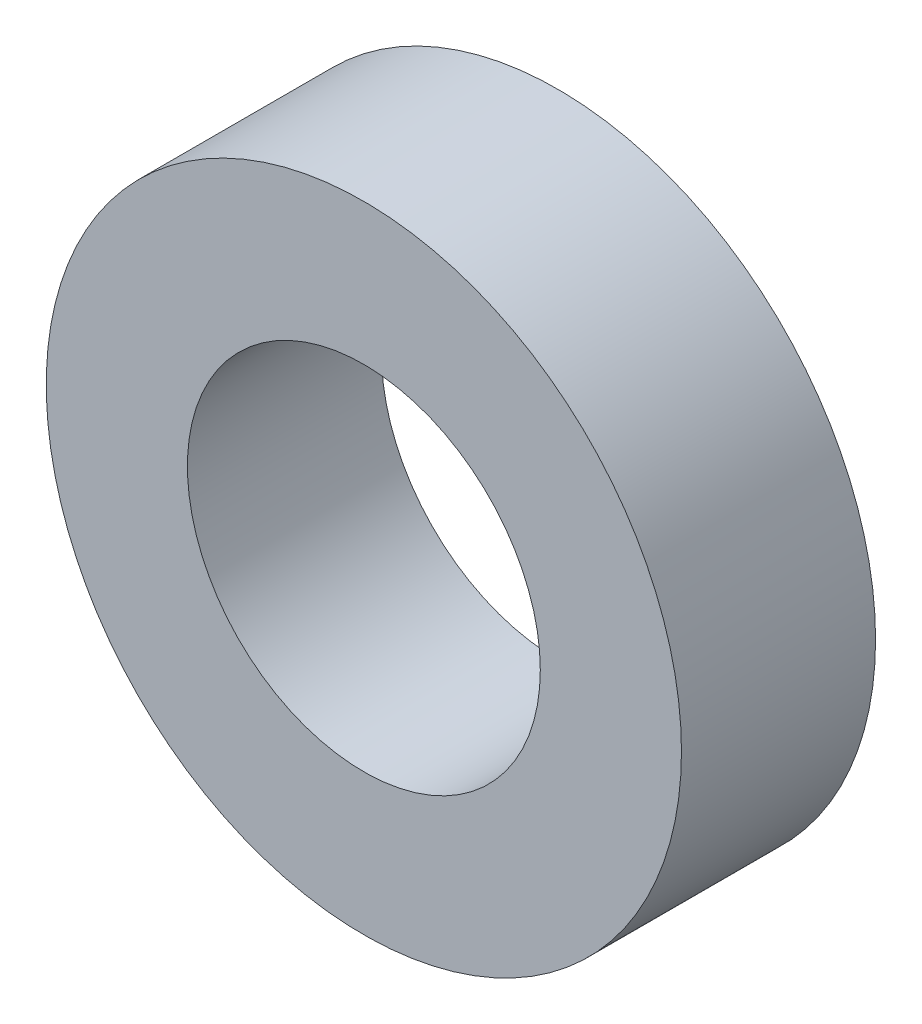
ISO-10303-21;
HEADER;
FILE_DESCRIPTION(('STEP AP214'),'2;1');
FILE_NAME('part.step','',(''),(''),'','','');
FILE_SCHEMA(('AUTOMOTIVE_DESIGN { 1 0 10303 214 1 1 1 1 }'));
ENDSEC;
DATA;
#1=APPLICATION_CONTEXT('core data for automotive mechanical design processes');
#2=APPLICATION_PROTOCOL_DEFINITION('international standard','automotive_design',2000,#1);
#3=PRODUCT_CONTEXT('',#1,'mechanical');
#4=PRODUCT('Part','Part','',(#3));
#5=PRODUCT_RELATED_PRODUCT_CATEGORY('part','',(#4));
#6=PRODUCT_DEFINITION_FORMATION('','',#4);
#7=PRODUCT_DEFINITION_CONTEXT('part definition',#1,'design');
#8=PRODUCT_DEFINITION('design','',#6,#7);
#9=PRODUCT_DEFINITION_SHAPE('','',#8);
#10=(LENGTH_UNIT() NAMED_UNIT(*) SI_UNIT(.MILLI.,.METRE.));
#11=(NAMED_UNIT(*) PLANE_ANGLE_UNIT() SI_UNIT($,.RADIAN.));
#12=(NAMED_UNIT(*) SI_UNIT($,.STERADIAN.) SOLID_ANGLE_UNIT());
#13=UNCERTAINTY_MEASURE_WITH_UNIT(LENGTH_MEASURE(1.E-05),#10,'distance_accuracy_value','');
#14=(GEOMETRIC_REPRESENTATION_CONTEXT(3) GLOBAL_UNCERTAINTY_ASSIGNED_CONTEXT((#13)) GLOBAL_UNIT_ASSIGNED_CONTEXT((#10,
#11,#12)) REPRESENTATION_CONTEXT('',''));
#15=CARTESIAN_POINT('',(0.,0.,0.));
#16=DIRECTION('',(0.,0.,1.));
#17=DIRECTION('',(1.,0.,0.));
#18=AXIS2_PLACEMENT_3D('',#15,#16,#17);
#19=CARTESIAN_POINT('',(0.,0.,2.75));
#20=DIRECTION('',(0.,0.,1.));
#21=DIRECTION('',(1.,0.,0.));
#22=AXIS2_PLACEMENT_3D('',#19,#20,#21);
#23=PLANE('',#22);
#24=CARTESIAN_POINT('',(0.,0.,2.75));
#25=DIRECTION('',(0.,0.,1.));
#26=DIRECTION('',(1.,0.,0.));
#27=AXIS2_PLACEMENT_3D('',#24,#25,#26);
#28=CIRCLE('',#27,9.);
#29=CARTESIAN_POINT('',(9.,0.,2.75));
#30=VERTEX_POINT('',#29);
#31=EDGE_CURVE('E10',#30,#30,#28,.T.);
#32=ORIENTED_EDGE('',*,*,#31,.T.);
#33=EDGE_LOOP('',(#32));
#34=FACE_BOUND('',#33,.T.);
#35=CARTESIAN_POINT('',(0.,0.,2.75));
#36=DIRECTION('',(0.,0.,1.));
#37=DIRECTION('',(1.,0.,0.));
#38=AXIS2_PLACEMENT_3D('',#35,#36,#37);
#39=CIRCLE('',#38,5.);
#40=CARTESIAN_POINT('',(5.,0.,2.75));
#41=VERTEX_POINT('',#40);
#42=EDGE_CURVE('E42',#41,#41,#39,.T.);
#43=ORIENTED_EDGE('',*,*,#42,.F.);
#44=EDGE_LOOP('',(#43));
#45=FACE_BOUND('',#44,.T.);
#46=ADVANCED_FACE('F31',(#34,#45),#23,.T.);
#47=CARTESIAN_POINT('',(0.,0.,-2.75));
#48=DIRECTION('',(0.,0.,1.));
#49=DIRECTION('',(1.,0.,0.));
#50=AXIS2_PLACEMENT_3D('',#47,#48,#49);
#51=PLANE('',#50);
#52=CARTESIAN_POINT('',(0.,0.,-2.75));
#53=DIRECTION('',(0.,0.,1.));
#54=DIRECTION('',(1.,0.,0.));
#55=AXIS2_PLACEMENT_3D('',#52,#53,#54);
#56=CIRCLE('',#55,9.);
#57=CARTESIAN_POINT('',(9.,0.,-2.75));
#58=VERTEX_POINT('',#57);
#59=EDGE_CURVE('E35',#58,#58,#56,.T.);
#60=ORIENTED_EDGE('',*,*,#59,.F.);
#61=EDGE_LOOP('',(#60));
#62=FACE_BOUND('',#61,.T.);
#63=CARTESIAN_POINT('',(0.,0.,-2.75));
#64=DIRECTION('',(0.,0.,1.));
#65=DIRECTION('',(1.,0.,0.));
#66=AXIS2_PLACEMENT_3D('',#63,#64,#65);
#67=CIRCLE('',#66,5.);
#68=CARTESIAN_POINT('',(5.,0.,-2.75));
#69=VERTEX_POINT('',#68);
#70=EDGE_CURVE('E44',#69,#69,#67,.T.);
#71=ORIENTED_EDGE('',*,*,#70,.T.);
#72=EDGE_LOOP('',(#71));
#73=FACE_BOUND('',#72,.T.);
#74=ADVANCED_FACE('F54',(#62,#73),#51,.F.);
#75=CARTESIAN_POINT('',(0.,0.,2.75));
#76=DIRECTION('',(0.,0.,-1.));
#77=DIRECTION('',(-1.,0.,0.));
#78=AXIS2_PLACEMENT_3D('',#75,#76,#77);
#79=CYLINDRICAL_SURFACE('',#78,9.);
#80=ORIENTED_EDGE('',*,*,#31,.F.);
#81=EDGE_LOOP('',(#80));
#82=FACE_BOUND('',#81,.T.);
#83=ORIENTED_EDGE('',*,*,#59,.T.);
#84=EDGE_LOOP('',(#83));
#85=FACE_BOUND('',#84,.T.);
#86=ADVANCED_FACE('F33',(#82,#85),#79,.T.);
#87=CARTESIAN_POINT('',(0.,0.,2.75));
#88=DIRECTION('',(0.,0.,-1.));
#89=DIRECTION('',(-1.,0.,0.));
#90=AXIS2_PLACEMENT_3D('',#87,#88,#89);
#91=CYLINDRICAL_SURFACE('',#90,5.);
#92=ORIENTED_EDGE('',*,*,#42,.T.);
#93=EDGE_LOOP('',(#92));
#94=FACE_BOUND('',#93,.T.);
#95=ORIENTED_EDGE('',*,*,#70,.F.);
#96=EDGE_LOOP('',(#95));
#97=FACE_BOUND('',#96,.T.);
#98=ADVANCED_FACE('F50',(#94,#97),#91,.F.);
#99=CLOSED_SHELL('',(#46,#74,#86,#98));
#100=MANIFOLD_SOLID_BREP('B2',#99);
#101=ADVANCED_BREP_SHAPE_REPRESENTATION('',(#18,#100),#14);
#102=SHAPE_DEFINITION_REPRESENTATION(#9,#101);
ENDSEC;
END-ISO-10303-21;
